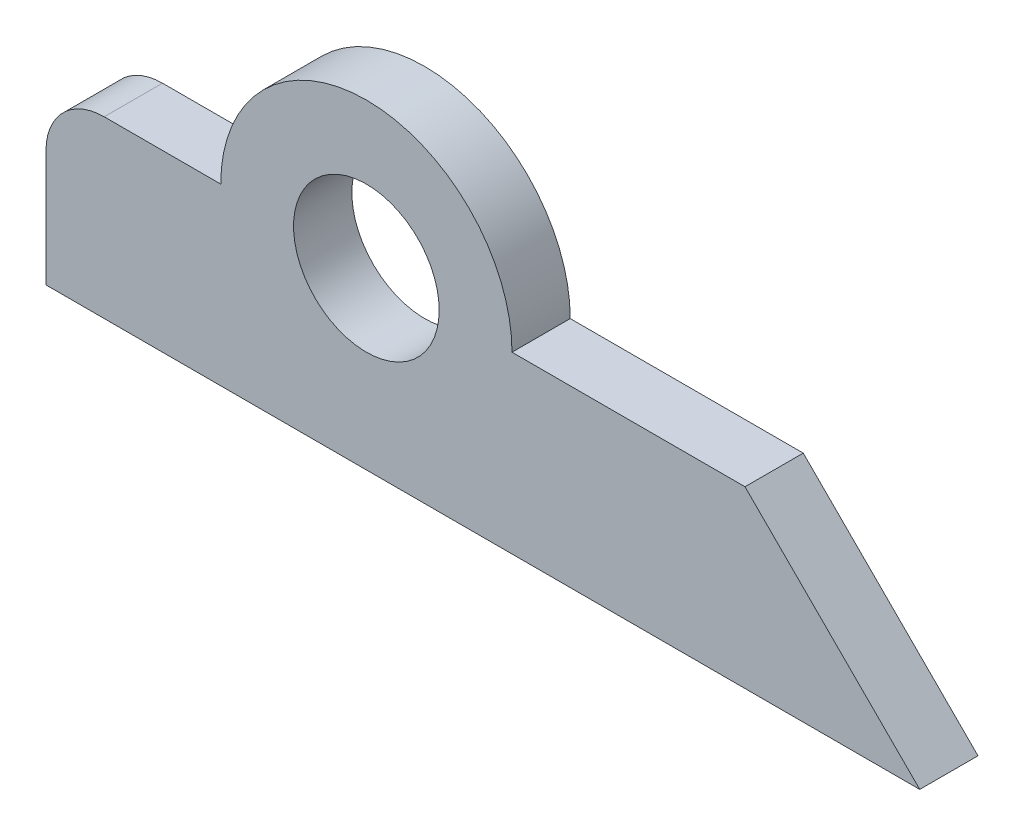
ISO-10303-21;
HEADER;
FILE_DESCRIPTION(('STEP AP214'),'2;1');
FILE_NAME('part.step','',(''),(''),'','','');
FILE_SCHEMA(('AUTOMOTIVE_DESIGN { 1 0 10303 214 1 1 1 1 }'));
ENDSEC;
DATA;
#1=APPLICATION_CONTEXT('core data for automotive mechanical design processes');
#2=APPLICATION_PROTOCOL_DEFINITION('international standard','automotive_design',2000,#1);
#3=PRODUCT_CONTEXT('',#1,'mechanical');
#4=PRODUCT('Part','Part','',(#3));
#5=PRODUCT_RELATED_PRODUCT_CATEGORY('part','',(#4));
#6=PRODUCT_DEFINITION_FORMATION('','',#4);
#7=PRODUCT_DEFINITION_CONTEXT('part definition',#1,'design');
#8=PRODUCT_DEFINITION('design','',#6,#7);
#9=PRODUCT_DEFINITION_SHAPE('','',#8);
#10=(LENGTH_UNIT() NAMED_UNIT(*) SI_UNIT(.MILLI.,.METRE.));
#11=(NAMED_UNIT(*) PLANE_ANGLE_UNIT() SI_UNIT($,.RADIAN.));
#12=(NAMED_UNIT(*) SI_UNIT($,.STERADIAN.) SOLID_ANGLE_UNIT());
#13=UNCERTAINTY_MEASURE_WITH_UNIT(LENGTH_MEASURE(1.E-05),#10,'distance_accuracy_value','');
#14=(GEOMETRIC_REPRESENTATION_CONTEXT(3) GLOBAL_UNCERTAINTY_ASSIGNED_CONTEXT((#13)) GLOBAL_UNIT_ASSIGNED_CONTEXT((#10,
#11,#12)) REPRESENTATION_CONTEXT('',''));
#15=CARTESIAN_POINT('',(0.,0.,0.));
#16=DIRECTION('',(0.,0.,1.));
#17=DIRECTION('',(1.,0.,0.));
#18=AXIS2_PLACEMENT_3D('',#15,#16,#17);
#19=CARTESIAN_POINT('',(0.,0.,10.));
#20=DIRECTION('',(0.,0.,1.));
#21=DIRECTION('',(1.,0.,0.));
#22=AXIS2_PLACEMENT_3D('',#19,#20,#21);
#23=PLANE('',#22);
#24=CARTESIAN_POINT('',(0.,0.,10.));
#25=DIRECTION('',(0.,0.,1.));
#26=DIRECTION('',(1.,0.,0.));
#27=AXIS2_PLACEMENT_3D('',#24,#25,#26);
#28=CIRCLE('',#27,25.);
#29=CARTESIAN_POINT('',(25.,0.,10.));
#30=VERTEX_POINT('',#29);
#31=CARTESIAN_POINT('',(-25.,0.,10.));
#32=VERTEX_POINT('',#31);
#33=EDGE_CURVE('E137',#30,#32,#28,.T.);
#34=ORIENTED_EDGE('',*,*,#33,.T.);
#35=DIRECTION('',(-1.,0.,0.));
#36=VECTOR('',#35,1.);
#37=CARTESIAN_POINT('',(-25.,0.,10.));
#38=LINE('',#37,#36);
#39=CARTESIAN_POINT('',(-44.9999999999999,0.,10.));
#40=VERTEX_POINT('',#39);
#41=EDGE_CURVE('E90',#32,#40,#38,.T.);
#42=ORIENTED_EDGE('',*,*,#41,.T.);
#43=CARTESIAN_POINT('',(-45.,-10.,10.));
#44=DIRECTION('',(0.,0.,1.));
#45=DIRECTION('',(1.,0.,0.));
#46=AXIS2_PLACEMENT_3D('',#43,#44,#45);
#47=CIRCLE('',#46,10.);
#48=CARTESIAN_POINT('',(-55.,-10.0000000000001,10.));
#49=VERTEX_POINT('',#48);
#50=EDGE_CURVE('E149',#40,#49,#47,.T.);
#51=ORIENTED_EDGE('',*,*,#50,.T.);
#52=DIRECTION('',(0.,-1.,0.));
#53=VECTOR('',#52,1.);
#54=CARTESIAN_POINT('',(-55.,-10.0000000000001,10.));
#55=LINE('',#54,#53);
#56=CARTESIAN_POINT('',(-55.,-30.,10.));
#57=VERTEX_POINT('',#56);
#58=EDGE_CURVE('E106',#49,#57,#55,.T.);
#59=ORIENTED_EDGE('',*,*,#58,.T.);
#60=DIRECTION('',(1.,0.,0.));
#61=VECTOR('',#60,1.);
#62=CARTESIAN_POINT('',(-55.,-30.,10.));
#63=LINE('',#62,#61);
#64=CARTESIAN_POINT('',(95.,-30.,10.));
#65=VERTEX_POINT('',#64);
#66=EDGE_CURVE('E100',#57,#65,#63,.T.);
#67=ORIENTED_EDGE('',*,*,#66,.T.);
#68=DIRECTION('',(-0.707106781186546,0.707106781186549,0.));
#69=VECTOR('',#68,1.);
#70=CARTESIAN_POINT('',(65.0000000000001,0.,10.));
#71=LINE('',#70,#69);
#72=CARTESIAN_POINT('',(65.0000000000001,0.,10.));
#73=VERTEX_POINT('',#72);
#74=EDGE_CURVE('E104',#65,#73,#71,.T.);
#75=ORIENTED_EDGE('',*,*,#74,.T.);
#76=DIRECTION('',(-1.,0.,0.));
#77=VECTOR('',#76,1.);
#78=CARTESIAN_POINT('',(25.,0.,10.));
#79=LINE('',#78,#77);
#80=EDGE_CURVE('E50',#73,#30,#79,.T.);
#81=ORIENTED_EDGE('',*,*,#80,.T.);
#82=EDGE_LOOP('',(#34,#42,#51,#59,#67,#75,#81));
#83=FACE_BOUND('',#82,.T.);
#84=CARTESIAN_POINT('',(0.,0.,10.));
#85=DIRECTION('',(0.,0.,1.));
#86=DIRECTION('',(1.,0.,0.));
#87=AXIS2_PLACEMENT_3D('',#84,#85,#86);
#88=CIRCLE('',#87,12.5);
#89=CARTESIAN_POINT('',(12.5,0.,10.));
#90=VERTEX_POINT('',#89);
#91=EDGE_CURVE('E128',#90,#90,#88,.T.);
#92=ORIENTED_EDGE('',*,*,#91,.F.);
#93=EDGE_LOOP('',(#92));
#94=FACE_BOUND('',#93,.T.);
#95=ADVANCED_FACE('F33',(#83,#94),#23,.T.);
#96=CARTESIAN_POINT('',(0.,0.,0.));
#97=DIRECTION('',(0.,0.,1.));
#98=DIRECTION('',(1.,0.,0.));
#99=AXIS2_PLACEMENT_3D('',#96,#97,#98);
#100=PLANE('',#99);
#101=CARTESIAN_POINT('',(0.,0.,0.));
#102=DIRECTION('',(0.,0.,1.));
#103=DIRECTION('',(1.,0.,0.));
#104=AXIS2_PLACEMENT_3D('',#101,#102,#103);
#105=CIRCLE('',#104,25.);
#106=CARTESIAN_POINT('',(25.,0.,0.));
#107=VERTEX_POINT('',#106);
#108=CARTESIAN_POINT('',(-25.,0.,0.));
#109=VERTEX_POINT('',#108);
#110=EDGE_CURVE('E124',#107,#109,#105,.T.);
#111=ORIENTED_EDGE('',*,*,#110,.F.);
#112=DIRECTION('',(-1.,0.,0.));
#113=VECTOR('',#112,1.);
#114=CARTESIAN_POINT('',(25.,0.,0.));
#115=LINE('',#114,#113);
#116=CARTESIAN_POINT('',(65.0000000000001,0.,0.));
#117=VERTEX_POINT('',#116);
#118=EDGE_CURVE('E82',#117,#107,#115,.T.);
#119=ORIENTED_EDGE('',*,*,#118,.F.);
#120=DIRECTION('',(-0.707106781186546,0.707106781186549,0.));
#121=VECTOR('',#120,1.);
#122=CARTESIAN_POINT('',(65.0000000000001,0.,0.));
#123=LINE('',#122,#121);
#124=CARTESIAN_POINT('',(95.,-30.,0.));
#125=VERTEX_POINT('',#124);
#126=EDGE_CURVE('E76',#125,#117,#123,.T.);
#127=ORIENTED_EDGE('',*,*,#126,.F.);
#128=DIRECTION('',(1.,0.,0.));
#129=VECTOR('',#128,1.);
#130=CARTESIAN_POINT('',(-55.,-30.,0.));
#131=LINE('',#130,#129);
#132=CARTESIAN_POINT('',(-55.,-30.,0.));
#133=VERTEX_POINT('',#132);
#134=EDGE_CURVE('E114',#133,#125,#131,.T.);
#135=ORIENTED_EDGE('',*,*,#134,.F.);
#136=DIRECTION('',(0.,-1.,0.));
#137=VECTOR('',#136,1.);
#138=CARTESIAN_POINT('',(-55.,-10.0000000000001,0.));
#139=LINE('',#138,#137);
#140=CARTESIAN_POINT('',(-55.,-10.0000000000001,0.));
#141=VERTEX_POINT('',#140);
#142=EDGE_CURVE('E132',#141,#133,#139,.T.);
#143=ORIENTED_EDGE('',*,*,#142,.F.);
#144=CARTESIAN_POINT('',(-45.,-10.,0.));
#145=DIRECTION('',(0.,0.,1.));
#146=DIRECTION('',(1.,0.,0.));
#147=AXIS2_PLACEMENT_3D('',#144,#145,#146);
#148=CIRCLE('',#147,10.);
#149=CARTESIAN_POINT('',(-44.9999999999999,0.,0.));
#150=VERTEX_POINT('',#149);
#151=EDGE_CURVE('E130',#150,#141,#148,.T.);
#152=ORIENTED_EDGE('',*,*,#151,.F.);
#153=DIRECTION('',(-1.,0.,0.));
#154=VECTOR('',#153,1.);
#155=CARTESIAN_POINT('',(-25.,0.,0.));
#156=LINE('',#155,#154);
#157=EDGE_CURVE('E127',#109,#150,#156,.T.);
#158=ORIENTED_EDGE('',*,*,#157,.F.);
#159=EDGE_LOOP('',(#111,#119,#127,#135,#143,#152,#158));
#160=FACE_BOUND('',#159,.T.);
#161=CARTESIAN_POINT('',(0.,0.,0.));
#162=DIRECTION('',(0.,0.,1.));
#163=DIRECTION('',(1.,0.,0.));
#164=AXIS2_PLACEMENT_3D('',#161,#162,#163);
#165=CIRCLE('',#164,12.5);
#166=CARTESIAN_POINT('',(12.5,0.,0.));
#167=VERTEX_POINT('',#166);
#168=EDGE_CURVE('E161',#167,#167,#165,.T.);
#169=ORIENTED_EDGE('',*,*,#168,.T.);
#170=EDGE_LOOP('',(#169));
#171=FACE_BOUND('',#170,.T.);
#172=ADVANCED_FACE('F153',(#160,#171),#100,.F.);
#173=CARTESIAN_POINT('',(0.,0.,10.));
#174=DIRECTION('',(0.,0.,-1.));
#175=DIRECTION('',(-1.,0.,0.));
#176=AXIS2_PLACEMENT_3D('',#173,#174,#175);
#177=CYLINDRICAL_SURFACE('',#176,25.);
#178=ORIENTED_EDGE('',*,*,#110,.T.);
#179=DIRECTION('',(0.,0.,-1.));
#180=VECTOR('',#179,1.);
#181=CARTESIAN_POINT('',(-25.,0.,10.));
#182=LINE('',#181,#180);
#183=EDGE_CURVE('E11',#32,#109,#182,.T.);
#184=ORIENTED_EDGE('',*,*,#183,.F.);
#185=ORIENTED_EDGE('',*,*,#33,.F.);
#186=DIRECTION('',(0.,0.,-1.));
#187=VECTOR('',#186,1.);
#188=CARTESIAN_POINT('',(25.,0.,10.));
#189=LINE('',#188,#187);
#190=EDGE_CURVE('E120',#30,#107,#189,.T.);
#191=ORIENTED_EDGE('',*,*,#190,.T.);
#192=EDGE_LOOP('',(#178,#184,#185,#191));
#193=FACE_BOUND('',#192,.T.);
#194=ADVANCED_FACE('F35',(#193),#177,.T.);
#195=CARTESIAN_POINT('',(-25.,0.,10.));
#196=DIRECTION('',(0.,-1.,0.));
#197=DIRECTION('',(1.,0.,0.));
#198=AXIS2_PLACEMENT_3D('',#195,#196,#197);
#199=PLANE('',#198);
#200=ORIENTED_EDGE('',*,*,#157,.T.);
#201=DIRECTION('',(0.,0.,-1.));
#202=VECTOR('',#201,1.);
#203=CARTESIAN_POINT('',(-44.9999999999999,0.,10.));
#204=LINE('',#203,#202);
#205=EDGE_CURVE('E42',#40,#150,#204,.T.);
#206=ORIENTED_EDGE('',*,*,#205,.F.);
#207=ORIENTED_EDGE('',*,*,#41,.F.);
#208=ORIENTED_EDGE('',*,*,#183,.T.);
#209=EDGE_LOOP('',(#200,#206,#207,#208));
#210=FACE_BOUND('',#209,.T.);
#211=ADVANCED_FACE('F187',(#210),#199,.F.);
#212=CARTESIAN_POINT('',(-45.,-10.,10.));
#213=DIRECTION('',(0.,0.,-1.));
#214=DIRECTION('',(-1.,0.,0.));
#215=AXIS2_PLACEMENT_3D('',#212,#213,#214);
#216=CYLINDRICAL_SURFACE('',#215,10.);
#217=ORIENTED_EDGE('',*,*,#151,.T.);
#218=DIRECTION('',(0.,0.,-1.));
#219=VECTOR('',#218,1.);
#220=CARTESIAN_POINT('',(-55.,-10.0000000000001,10.));
#221=LINE('',#220,#219);
#222=EDGE_CURVE('E141',#49,#141,#221,.T.);
#223=ORIENTED_EDGE('',*,*,#222,.F.);
#224=ORIENTED_EDGE('',*,*,#50,.F.);
#225=ORIENTED_EDGE('',*,*,#205,.T.);
#226=EDGE_LOOP('',(#217,#223,#224,#225));
#227=FACE_BOUND('',#226,.T.);
#228=ADVANCED_FACE('F147',(#227),#216,.T.);
#229=CARTESIAN_POINT('',(-55.,-10.0000000000001,10.));
#230=DIRECTION('',(1.,0.,0.));
#231=DIRECTION('',(0.,1.,0.));
#232=AXIS2_PLACEMENT_3D('',#229,#230,#231);
#233=PLANE('',#232);
#234=ORIENTED_EDGE('',*,*,#142,.T.);
#235=DIRECTION('',(0.,0.,-1.));
#236=VECTOR('',#235,1.);
#237=CARTESIAN_POINT('',(-55.,-30.,10.));
#238=LINE('',#237,#236);
#239=EDGE_CURVE('E115',#57,#133,#238,.T.);
#240=ORIENTED_EDGE('',*,*,#239,.F.);
#241=ORIENTED_EDGE('',*,*,#58,.F.);
#242=ORIENTED_EDGE('',*,*,#222,.T.);
#243=EDGE_LOOP('',(#234,#240,#241,#242));
#244=FACE_BOUND('',#243,.T.);
#245=ADVANCED_FACE('F156',(#244),#233,.F.);
#246=CARTESIAN_POINT('',(-55.,-30.,10.));
#247=DIRECTION('',(0.,1.,0.));
#248=DIRECTION('',(0.,0.,1.));
#249=AXIS2_PLACEMENT_3D('',#246,#247,#248);
#250=PLANE('',#249);
#251=ORIENTED_EDGE('',*,*,#134,.T.);
#252=DIRECTION('',(0.,0.,-1.));
#253=VECTOR('',#252,1.);
#254=CARTESIAN_POINT('',(95.,-30.,10.));
#255=LINE('',#254,#253);
#256=EDGE_CURVE('E111',#65,#125,#255,.T.);
#257=ORIENTED_EDGE('',*,*,#256,.F.);
#258=ORIENTED_EDGE('',*,*,#66,.F.);
#259=ORIENTED_EDGE('',*,*,#239,.T.);
#260=EDGE_LOOP('',(#251,#257,#258,#259));
#261=FACE_BOUND('',#260,.T.);
#262=ADVANCED_FACE('F112',(#261),#250,.F.);
#263=CARTESIAN_POINT('',(65.0000000000001,0.,10.));
#264=DIRECTION('',(-0.707106781186549,-0.707106781186546,0.));
#265=DIRECTION('',(0.707106781186546,-0.707106781186549,0.));
#266=AXIS2_PLACEMENT_3D('',#263,#264,#265);
#267=PLANE('',#266);
#268=ORIENTED_EDGE('',*,*,#126,.T.);
#269=DIRECTION('',(0.,0.,-1.));
#270=VECTOR('',#269,1.);
#271=CARTESIAN_POINT('',(65.0000000000001,0.,10.));
#272=LINE('',#271,#270);
#273=EDGE_CURVE('E116',#73,#117,#272,.T.);
#274=ORIENTED_EDGE('',*,*,#273,.F.);
#275=ORIENTED_EDGE('',*,*,#74,.F.);
#276=ORIENTED_EDGE('',*,*,#256,.T.);
#277=EDGE_LOOP('',(#268,#274,#275,#276));
#278=FACE_BOUND('',#277,.T.);
#279=ADVANCED_FACE('F118',(#278),#267,.F.);
#280=CARTESIAN_POINT('',(25.,0.,10.));
#281=DIRECTION('',(0.,-1.,0.));
#282=DIRECTION('',(1.,0.,0.));
#283=AXIS2_PLACEMENT_3D('',#280,#281,#282);
#284=PLANE('',#283);
#285=ORIENTED_EDGE('',*,*,#118,.T.);
#286=ORIENTED_EDGE('',*,*,#190,.F.);
#287=ORIENTED_EDGE('',*,*,#80,.F.);
#288=ORIENTED_EDGE('',*,*,#273,.T.);
#289=EDGE_LOOP('',(#285,#286,#287,#288));
#290=FACE_BOUND('',#289,.T.);
#291=ADVANCED_FACE('F177',(#290),#284,.F.);
#292=CARTESIAN_POINT('',(0.,0.,10.));
#293=DIRECTION('',(0.,0.,-1.));
#294=DIRECTION('',(-1.,0.,0.));
#295=AXIS2_PLACEMENT_3D('',#292,#293,#294);
#296=CYLINDRICAL_SURFACE('',#295,12.5);
#297=ORIENTED_EDGE('',*,*,#91,.T.);
#298=EDGE_LOOP('',(#297));
#299=FACE_BOUND('',#298,.T.);
#300=ORIENTED_EDGE('',*,*,#168,.F.);
#301=EDGE_LOOP('',(#300));
#302=FACE_BOUND('',#301,.T.);
#303=ADVANCED_FACE('F167',(#299,#302),#296,.F.);
#304=CLOSED_SHELL('',(#95,#172,#194,#211,#228,#245,#262,#279,#291,#303));
#305=MANIFOLD_SOLID_BREP('B2',#304);
#306=ADVANCED_BREP_SHAPE_REPRESENTATION('',(#18,#305),#14);
#307=SHAPE_DEFINITION_REPRESENTATION(#9,#306);
ENDSEC;
END-ISO-10303-21;
